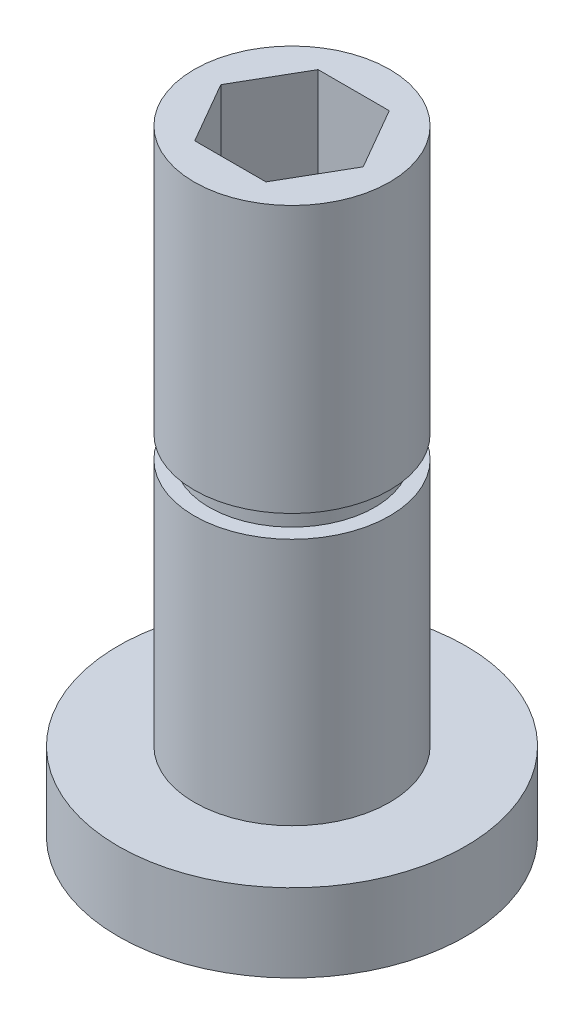
ISO-10303-21;
HEADER;
FILE_DESCRIPTION(('STEP AP214'),'2;1');
FILE_NAME('part.step','',(''),(''),'','','');
FILE_SCHEMA(('AUTOMOTIVE_DESIGN { 1 0 10303 214 1 1 1 1 }'));
ENDSEC;
DATA;
#1=APPLICATION_CONTEXT('core data for automotive mechanical design processes');
#2=APPLICATION_PROTOCOL_DEFINITION('international standard','automotive_design',2000,#1);
#3=PRODUCT_CONTEXT('',#1,'mechanical');
#4=PRODUCT('Part','Part','',(#3));
#5=PRODUCT_RELATED_PRODUCT_CATEGORY('part','',(#4));
#6=PRODUCT_DEFINITION_FORMATION('','',#4);
#7=PRODUCT_DEFINITION_CONTEXT('part definition',#1,'design');
#8=PRODUCT_DEFINITION('design','',#6,#7);
#9=PRODUCT_DEFINITION_SHAPE('','',#8);
#10=(LENGTH_UNIT() NAMED_UNIT(*) SI_UNIT(.MILLI.,.METRE.));
#11=(NAMED_UNIT(*) PLANE_ANGLE_UNIT() SI_UNIT($,.RADIAN.));
#12=(NAMED_UNIT(*) SI_UNIT($,.STERADIAN.) SOLID_ANGLE_UNIT());
#13=UNCERTAINTY_MEASURE_WITH_UNIT(LENGTH_MEASURE(1.E-05),#10,'distance_accuracy_value','');
#14=(GEOMETRIC_REPRESENTATION_CONTEXT(3) GLOBAL_UNCERTAINTY_ASSIGNED_CONTEXT((#13)) GLOBAL_UNIT_ASSIGNED_CONTEXT((#10,
#11,#12)) REPRESENTATION_CONTEXT('',''));
#15=CARTESIAN_POINT('',(0.,0.,0.));
#16=DIRECTION('',(0.,0.,1.));
#17=DIRECTION('',(1.,0.,0.));
#18=AXIS2_PLACEMENT_3D('',#15,#16,#17);
#19=CARTESIAN_POINT('',(0.,31.5,0.));
#20=DIRECTION('',(0.,-1.,0.));
#21=DIRECTION('',(0.,0.,-0.999999999999991));
#22=AXIS2_PLACEMENT_3D('',#19,#20,#21);
#23=CYLINDRICAL_SURFACE('',#22,5.);
#24=CARTESIAN_POINT('',(0.,4.,0.));
#25=DIRECTION('',(0.,1.,0.));
#26=DIRECTION('',(0.,0.,0.999999999999991));
#27=AXIS2_PLACEMENT_3D('',#24,#25,#26);
#28=CIRCLE('',#27,5.);
#29=CARTESIAN_POINT('',(0.,4.,4.99999999999995));
#30=VERTEX_POINT('',#29);
#31=EDGE_CURVE('E158',#30,#30,#28,.T.);
#32=ORIENTED_EDGE('',*,*,#31,.T.);
#33=EDGE_LOOP('',(#32));
#34=FACE_BOUND('',#33,.T.);
#35=CARTESIAN_POINT('',(0.,16.7,0.));
#36=DIRECTION('',(0.,1.,0.));
#37=DIRECTION('',(0.,0.,0.999999999999991));
#38=AXIS2_PLACEMENT_3D('',#35,#36,#37);
#39=CIRCLE('',#38,5.);
#40=CARTESIAN_POINT('',(0.,16.7,4.99999999999995));
#41=VERTEX_POINT('',#40);
#42=EDGE_CURVE('E152',#41,#41,#39,.T.);
#43=ORIENTED_EDGE('',*,*,#42,.F.);
#44=EDGE_LOOP('',(#43));
#45=FACE_BOUND('',#44,.T.);
#46=ADVANCED_FACE('F41',(#34,#45),#23,.T.);
#47=CARTESIAN_POINT('',(0.,4.,0.));
#48=DIRECTION('',(0.,-1.,0.));
#49=DIRECTION('',(0.,0.,-0.999999999999991));
#50=AXIS2_PLACEMENT_3D('',#47,#48,#49);
#51=CYLINDRICAL_SURFACE('',#50,8.89);
#52=CARTESIAN_POINT('',(0.,4.,0.));
#53=DIRECTION('',(0.,1.,0.));
#54=DIRECTION('',(0.,0.,0.999999999999991));
#55=AXIS2_PLACEMENT_3D('',#52,#53,#54);
#56=CIRCLE('',#55,8.89);
#57=CARTESIAN_POINT('',(0.,4.,8.88999999999992));
#58=VERTEX_POINT('',#57);
#59=EDGE_CURVE('E11',#58,#58,#56,.T.);
#60=ORIENTED_EDGE('',*,*,#59,.F.);
#61=EDGE_LOOP('',(#60));
#62=FACE_BOUND('',#61,.T.);
#63=CARTESIAN_POINT('',(0.,0.,0.));
#64=DIRECTION('',(0.,1.,0.));
#65=DIRECTION('',(0.,0.,0.999999999999991));
#66=AXIS2_PLACEMENT_3D('',#63,#64,#65);
#67=CIRCLE('',#66,8.89);
#68=CARTESIAN_POINT('',(0.,0.,8.88999999999992));
#69=VERTEX_POINT('',#68);
#70=EDGE_CURVE('E45',#69,#69,#67,.T.);
#71=ORIENTED_EDGE('',*,*,#70,.T.);
#72=EDGE_LOOP('',(#71));
#73=FACE_BOUND('',#72,.T.);
#74=ADVANCED_FACE('F43',(#62,#73),#51,.T.);
#75=CARTESIAN_POINT('',(0.,4.,0.));
#76=DIRECTION('',(0.,1.,0.));
#77=DIRECTION('',(0.,0.,0.999999999999991));
#78=AXIS2_PLACEMENT_3D('',#75,#76,#77);
#79=PLANE('',#78);
#80=ORIENTED_EDGE('',*,*,#31,.F.);
#81=EDGE_LOOP('',(#80));
#82=FACE_BOUND('',#81,.T.);
#83=ORIENTED_EDGE('',*,*,#59,.T.);
#84=EDGE_LOOP('',(#83));
#85=FACE_BOUND('',#84,.T.);
#86=ADVANCED_FACE('F169',(#82,#85),#79,.T.);
#87=CARTESIAN_POINT('',(0.,0.,0.));
#88=DIRECTION('',(0.,1.,0.));
#89=DIRECTION('',(0.,0.,0.999999999999991));
#90=AXIS2_PLACEMENT_3D('',#87,#88,#89);
#91=PLANE('',#90);
#92=ORIENTED_EDGE('',*,*,#70,.F.);
#93=EDGE_LOOP('',(#92));
#94=FACE_BOUND('',#93,.T.);
#95=ADVANCED_FACE('F172',(#94),#91,.F.);
#96=CARTESIAN_POINT('',(0.,17.843,0.));
#97=DIRECTION('',(0.,1.,0.));
#98=DIRECTION('',(0.,0.,0.999999999999991));
#99=AXIS2_PLACEMENT_3D('',#96,#97,#98);
#100=PLANE('',#99);
#101=CARTESIAN_POINT('',(0.,17.843,0.));
#102=DIRECTION('',(0.,1.,0.));
#103=DIRECTION('',(0.,0.,0.999999999999991));
#104=AXIS2_PLACEMENT_3D('',#101,#102,#103);
#105=CIRCLE('',#104,5.);
#106=CARTESIAN_POINT('',(0.,17.843,4.99999999999995));
#107=VERTEX_POINT('',#106);
#108=EDGE_CURVE('E155',#107,#107,#105,.T.);
#109=ORIENTED_EDGE('',*,*,#108,.F.);
#110=EDGE_LOOP('',(#109));
#111=FACE_BOUND('',#110,.T.);
#112=CARTESIAN_POINT('',(0.,17.843,0.));
#113=DIRECTION('',(0.,1.,0.));
#114=DIRECTION('',(0.,0.,0.999999999999991));
#115=AXIS2_PLACEMENT_3D('',#112,#113,#114);
#116=CIRCLE('',#115,4.238);
#117=CARTESIAN_POINT('',(0.,17.843,4.23799999999996));
#118=VERTEX_POINT('',#117);
#119=EDGE_CURVE('E149',#118,#118,#116,.T.);
#120=ORIENTED_EDGE('',*,*,#119,.T.);
#121=EDGE_LOOP('',(#120));
#122=FACE_BOUND('',#121,.T.);
#123=ADVANCED_FACE('F182',(#111,#122),#100,.F.);
#124=CARTESIAN_POINT('',(0.,16.7,0.));
#125=DIRECTION('',(0.,1.,0.));
#126=DIRECTION('',(0.,0.,0.999999999999991));
#127=AXIS2_PLACEMENT_3D('',#124,#125,#126);
#128=PLANE('',#127);
#129=ORIENTED_EDGE('',*,*,#42,.T.);
#130=EDGE_LOOP('',(#129));
#131=FACE_BOUND('',#130,.T.);
#132=CARTESIAN_POINT('',(0.,16.7,0.));
#133=DIRECTION('',(0.,1.,0.));
#134=DIRECTION('',(0.,0.,0.999999999999991));
#135=AXIS2_PLACEMENT_3D('',#132,#133,#134);
#136=CIRCLE('',#135,4.238);
#137=CARTESIAN_POINT('',(0.,16.7,4.23799999999996));
#138=VERTEX_POINT('',#137);
#139=EDGE_CURVE('E143',#138,#138,#136,.T.);
#140=ORIENTED_EDGE('',*,*,#139,.F.);
#141=EDGE_LOOP('',(#140));
#142=FACE_BOUND('',#141,.T.);
#143=ADVANCED_FACE('F186',(#131,#142),#128,.T.);
#144=CARTESIAN_POINT('',(0.,17.843,0.));
#145=DIRECTION('',(0.,-1.,0.));
#146=DIRECTION('',(0.,0.,-0.999999999999991));
#147=AXIS2_PLACEMENT_3D('',#144,#145,#146);
#148=CYLINDRICAL_SURFACE('',#147,4.238);
#149=ORIENTED_EDGE('',*,*,#119,.F.);
#150=EDGE_LOOP('',(#149));
#151=FACE_BOUND('',#150,.T.);
#152=ORIENTED_EDGE('',*,*,#139,.T.);
#153=EDGE_LOOP('',(#152));
#154=FACE_BOUND('',#153,.T.);
#155=ADVANCED_FACE('F205',(#151,#154),#148,.T.);
#156=CARTESIAN_POINT('',(0.,31.5,0.));
#157=DIRECTION('',(0.,1.,0.));
#158=DIRECTION('',(0.,0.,0.999999999999991));
#159=AXIS2_PLACEMENT_3D('',#156,#157,#158);
#160=PLANE('',#159);
#161=DIRECTION('',(0.499999999999994,0.,-0.86602540378443));
#162=VECTOR('',#161,1.);
#163=CARTESIAN_POINT('',(1.82245000000004,31.5,3.15657599425395));
#164=LINE('',#163,#162);
#165=CARTESIAN_POINT('',(1.82245000000004,31.5,3.15657599425395));
#166=VERTEX_POINT('',#165);
#167=CARTESIAN_POINT('',(3.64490000000001,31.5,0.));
#168=VERTEX_POINT('',#167);
#169=EDGE_CURVE('E56',#166,#168,#164,.T.);
#170=ORIENTED_EDGE('',*,*,#169,.F.);
#171=DIRECTION('',(0.999999999999991,0.,0.));
#172=VECTOR('',#171,1.);
#173=CARTESIAN_POINT('',(-1.82244999999999,31.5,3.15657599425388));
#174=LINE('',#173,#172);
#175=CARTESIAN_POINT('',(-1.82244999999999,31.5,3.15657599425388));
#176=VERTEX_POINT('',#175);
#177=EDGE_CURVE('E139',#176,#166,#174,.T.);
#178=ORIENTED_EDGE('',*,*,#177,.F.);
#179=DIRECTION('',(0.499999999999994,0.,0.866025403784431));
#180=VECTOR('',#179,1.);
#181=CARTESIAN_POINT('',(-3.64490000000009,31.5,0.));
#182=LINE('',#181,#180);
#183=CARTESIAN_POINT('',(-3.64490000000009,31.5,0.));
#184=VERTEX_POINT('',#183);
#185=EDGE_CURVE('E137',#184,#176,#182,.T.);
#186=ORIENTED_EDGE('',*,*,#185,.F.);
#187=DIRECTION('',(-0.499999999999994,0.,0.86602540378443));
#188=VECTOR('',#187,1.);
#189=CARTESIAN_POINT('',(-1.82244999999967,31.5,-3.15657599425367));
#190=LINE('',#189,#188);
#191=CARTESIAN_POINT('',(-1.82244999999967,31.5,-3.15657599425367));
#192=VERTEX_POINT('',#191);
#193=EDGE_CURVE('E104',#192,#184,#190,.T.);
#194=ORIENTED_EDGE('',*,*,#193,.F.);
#195=DIRECTION('',(-0.999999999999991,0.,0.));
#196=VECTOR('',#195,1.);
#197=CARTESIAN_POINT('',(1.82245000000029,31.5,-3.15657599425373));
#198=LINE('',#197,#196);
#199=CARTESIAN_POINT('',(1.82245000000029,31.5,-3.15657599425373));
#200=VERTEX_POINT('',#199);
#201=EDGE_CURVE('E133',#200,#192,#198,.T.);
#202=ORIENTED_EDGE('',*,*,#201,.F.);
#203=DIRECTION('',(-0.499999999999994,0.,-0.866025403784431));
#204=VECTOR('',#203,1.);
#205=CARTESIAN_POINT('',(3.64490000000001,31.5,0.));
#206=LINE('',#205,#204);
#207=EDGE_CURVE('E130',#168,#200,#206,.T.);
#208=ORIENTED_EDGE('',*,*,#207,.F.);
#209=EDGE_LOOP('',(#170,#178,#186,#194,#202,#208));
#210=FACE_BOUND('',#209,.T.);
#211=CARTESIAN_POINT('',(0.,31.5,0.));
#212=DIRECTION('',(0.,1.,0.));
#213=DIRECTION('',(0.,0.,0.999999999999991));
#214=AXIS2_PLACEMENT_3D('',#211,#212,#213);
#215=CIRCLE('',#214,5.);
#216=CARTESIAN_POINT('',(0.,31.5,4.99999999999995));
#217=VERTEX_POINT('',#216);
#218=EDGE_CURVE('E161',#217,#217,#215,.T.);
#219=ORIENTED_EDGE('',*,*,#218,.T.);
#220=EDGE_LOOP('',(#219));
#221=FACE_BOUND('',#220,.T.);
#222=ADVANCED_FACE('F197',(#210,#221),#160,.T.);
#223=ORIENTED_EDGE('',*,*,#108,.T.);
#224=EDGE_LOOP('',(#223));
#225=FACE_BOUND('',#224,.T.);
#226=ORIENTED_EDGE('',*,*,#218,.F.);
#227=EDGE_LOOP('',(#226));
#228=FACE_BOUND('',#227,.T.);
#229=ADVANCED_FACE('F191',(#225,#228),#23,.T.);
#230=CARTESIAN_POINT('',(1.82245000000004,20.451,3.15657599425395));
#231=DIRECTION('',(0.86602540378443,0.,0.499999999999994));
#232=DIRECTION('',(0.499999999999994,0.,-0.86602540378443));
#233=AXIS2_PLACEMENT_3D('',#230,#231,#232);
#234=PLANE('',#233);
#235=ORIENTED_EDGE('',*,*,#169,.T.);
#236=DIRECTION('',(0.,1.,0.));
#237=VECTOR('',#236,1.);
#238=CARTESIAN_POINT('',(3.64490000000001,20.451,0.));
#239=LINE('',#238,#237);
#240=CARTESIAN_POINT('',(3.64490000000001,20.451,0.));
#241=VERTEX_POINT('',#240);
#242=EDGE_CURVE('E86',#241,#168,#239,.T.);
#243=ORIENTED_EDGE('',*,*,#242,.F.);
#244=DIRECTION('',(0.499999999999994,0.,-0.86602540378443));
#245=VECTOR('',#244,1.);
#246=CARTESIAN_POINT('',(1.82245000000004,20.451,3.15657599425395));
#247=LINE('',#246,#245);
#248=CARTESIAN_POINT('',(1.82245000000004,20.451,3.15657599425395));
#249=VERTEX_POINT('',#248);
#250=EDGE_CURVE('E141',#249,#241,#247,.T.);
#251=ORIENTED_EDGE('',*,*,#250,.F.);
#252=DIRECTION('',(0.,1.,0.));
#253=VECTOR('',#252,1.);
#254=CARTESIAN_POINT('',(1.82245000000004,20.451,3.15657599425395));
#255=LINE('',#254,#253);
#256=EDGE_CURVE('E64',#249,#166,#255,.T.);
#257=ORIENTED_EDGE('',*,*,#256,.T.);
#258=EDGE_LOOP('',(#235,#243,#251,#257));
#259=FACE_BOUND('',#258,.T.);
#260=ADVANCED_FACE('F196',(#259),#234,.F.);
#261=CARTESIAN_POINT('',(-1.82244999999999,20.451,3.15657599425388));
#262=DIRECTION('',(0.,0.,0.999999999999991));
#263=DIRECTION('',(0.999999999999991,0.,0.));
#264=AXIS2_PLACEMENT_3D('',#261,#262,#263);
#265=PLANE('',#264);
#266=ORIENTED_EDGE('',*,*,#177,.T.);
#267=ORIENTED_EDGE('',*,*,#256,.F.);
#268=DIRECTION('',(0.999999999999991,0.,0.));
#269=VECTOR('',#268,1.);
#270=CARTESIAN_POINT('',(-1.82244999999999,20.451,3.15657599425388));
#271=LINE('',#270,#269);
#272=CARTESIAN_POINT('',(-1.82244999999999,20.451,3.15657599425388));
#273=VERTEX_POINT('',#272);
#274=EDGE_CURVE('E116',#273,#249,#271,.T.);
#275=ORIENTED_EDGE('',*,*,#274,.F.);
#276=DIRECTION('',(0.,1.,0.));
#277=VECTOR('',#276,1.);
#278=CARTESIAN_POINT('',(-1.82244999999999,20.451,3.15657599425388));
#279=LINE('',#278,#277);
#280=EDGE_CURVE('E108',#273,#176,#279,.T.);
#281=ORIENTED_EDGE('',*,*,#280,.T.);
#282=EDGE_LOOP('',(#266,#267,#275,#281));
#283=FACE_BOUND('',#282,.T.);
#284=ADVANCED_FACE('F203',(#283),#265,.F.);
#285=CARTESIAN_POINT('',(-3.64490000000009,20.451,0.));
#286=DIRECTION('',(-0.866025403784431,0.,0.499999999999994));
#287=DIRECTION('',(0.499999999999994,0.,0.866025403784431));
#288=AXIS2_PLACEMENT_3D('',#285,#286,#287);
#289=PLANE('',#288);
#290=ORIENTED_EDGE('',*,*,#185,.T.);
#291=ORIENTED_EDGE('',*,*,#280,.F.);
#292=DIRECTION('',(0.499999999999994,0.,0.866025403784431));
#293=VECTOR('',#292,1.);
#294=CARTESIAN_POINT('',(-3.64490000000009,20.451,0.));
#295=LINE('',#294,#293);
#296=CARTESIAN_POINT('',(-3.64490000000009,20.451,0.));
#297=VERTEX_POINT('',#296);
#298=EDGE_CURVE('E112',#297,#273,#295,.T.);
#299=ORIENTED_EDGE('',*,*,#298,.F.);
#300=DIRECTION('',(0.,1.,0.));
#301=VECTOR('',#300,1.);
#302=CARTESIAN_POINT('',(-3.64490000000009,20.451,0.));
#303=LINE('',#302,#301);
#304=EDGE_CURVE('E97',#297,#184,#303,.T.);
#305=ORIENTED_EDGE('',*,*,#304,.T.);
#306=EDGE_LOOP('',(#290,#291,#299,#305));
#307=FACE_BOUND('',#306,.T.);
#308=ADVANCED_FACE('F113',(#307),#289,.F.);
#309=CARTESIAN_POINT('',(-1.82244999999967,20.451,-3.15657599425367));
#310=DIRECTION('',(-0.86602540378443,0.,-0.499999999999994));
#311=DIRECTION('',(-0.499999999999994,0.,0.86602540378443));
#312=AXIS2_PLACEMENT_3D('',#309,#310,#311);
#313=PLANE('',#312);
#314=ORIENTED_EDGE('',*,*,#193,.T.);
#315=ORIENTED_EDGE('',*,*,#304,.F.);
#316=DIRECTION('',(-0.499999999999994,0.,0.86602540378443));
#317=VECTOR('',#316,1.);
#318=CARTESIAN_POINT('',(-1.82244999999967,20.451,-3.15657599425367));
#319=LINE('',#318,#317);
#320=CARTESIAN_POINT('',(-1.82244999999967,20.451,-3.15657599425367));
#321=VERTEX_POINT('',#320);
#322=EDGE_CURVE('E101',#321,#297,#319,.T.);
#323=ORIENTED_EDGE('',*,*,#322,.F.);
#324=DIRECTION('',(0.,1.,0.));
#325=VECTOR('',#324,1.);
#326=CARTESIAN_POINT('',(-1.82244999999967,20.451,-3.15657599425367));
#327=LINE('',#326,#325);
#328=EDGE_CURVE('E109',#321,#192,#327,.T.);
#329=ORIENTED_EDGE('',*,*,#328,.T.);
#330=EDGE_LOOP('',(#314,#315,#323,#329));
#331=FACE_BOUND('',#330,.T.);
#332=ADVANCED_FACE('F99',(#331),#313,.F.);
#333=CARTESIAN_POINT('',(1.82245000000029,20.451,-3.15657599425373));
#334=DIRECTION('',(0.,0.,-0.999999999999991));
#335=DIRECTION('',(-0.999999999999991,0.,0.));
#336=AXIS2_PLACEMENT_3D('',#333,#334,#335);
#337=PLANE('',#336);
#338=ORIENTED_EDGE('',*,*,#201,.T.);
#339=ORIENTED_EDGE('',*,*,#328,.F.);
#340=DIRECTION('',(-0.999999999999991,0.,0.));
#341=VECTOR('',#340,1.);
#342=CARTESIAN_POINT('',(1.82245000000029,20.451,-3.15657599425373));
#343=LINE('',#342,#341);
#344=CARTESIAN_POINT('',(1.82245000000029,20.451,-3.15657599425373));
#345=VERTEX_POINT('',#344);
#346=EDGE_CURVE('E122',#345,#321,#343,.T.);
#347=ORIENTED_EDGE('',*,*,#346,.F.);
#348=DIRECTION('',(0.,1.,0.));
#349=VECTOR('',#348,1.);
#350=CARTESIAN_POINT('',(1.82245000000029,20.451,-3.15657599425373));
#351=LINE('',#350,#349);
#352=EDGE_CURVE('E146',#345,#200,#351,.T.);
#353=ORIENTED_EDGE('',*,*,#352,.T.);
#354=EDGE_LOOP('',(#338,#339,#347,#353));
#355=FACE_BOUND('',#354,.T.);
#356=ADVANCED_FACE('F228',(#355),#337,.F.);
#357=CARTESIAN_POINT('',(3.64490000000001,20.451,0.));
#358=DIRECTION('',(0.866025403784431,0.,-0.499999999999994));
#359=DIRECTION('',(-0.499999999999994,0.,-0.866025403784431));
#360=AXIS2_PLACEMENT_3D('',#357,#358,#359);
#361=PLANE('',#360);
#362=ORIENTED_EDGE('',*,*,#207,.T.);
#363=ORIENTED_EDGE('',*,*,#352,.F.);
#364=DIRECTION('',(-0.499999999999994,0.,-0.866025403784431));
#365=VECTOR('',#364,1.);
#366=CARTESIAN_POINT('',(3.64490000000001,20.451,0.));
#367=LINE('',#366,#365);
#368=EDGE_CURVE('E124',#241,#345,#367,.T.);
#369=ORIENTED_EDGE('',*,*,#368,.F.);
#370=ORIENTED_EDGE('',*,*,#242,.T.);
#371=EDGE_LOOP('',(#362,#363,#369,#370));
#372=FACE_BOUND('',#371,.T.);
#373=ADVANCED_FACE('F225',(#372),#361,.F.);
#374=CARTESIAN_POINT('',(0.,20.451,0.));
#375=DIRECTION('',(0.,1.,0.));
#376=DIRECTION('',(0.,0.,0.999999999999991));
#377=AXIS2_PLACEMENT_3D('',#374,#375,#376);
#378=PLANE('',#377);
#379=ORIENTED_EDGE('',*,*,#250,.T.);
#380=ORIENTED_EDGE('',*,*,#368,.T.);
#381=ORIENTED_EDGE('',*,*,#346,.T.);
#382=ORIENTED_EDGE('',*,*,#322,.T.);
#383=ORIENTED_EDGE('',*,*,#298,.T.);
#384=ORIENTED_EDGE('',*,*,#274,.T.);
#385=EDGE_LOOP('',(#379,#380,#381,#382,#383,#384));
#386=FACE_BOUND('',#385,.T.);
#387=ADVANCED_FACE('F119',(#386),#378,.T.);
#388=CLOSED_SHELL('',(#46,#74,#86,#95,#123,#143,#155,#222,#229,#260,#284,#308,#332,#356,#373,#387));
#389=MANIFOLD_SOLID_BREP('B2',#388);
#390=ADVANCED_BREP_SHAPE_REPRESENTATION('',(#18,#389),#14);
#391=SHAPE_DEFINITION_REPRESENTATION(#9,#390);
ENDSEC;
END-ISO-10303-21;
